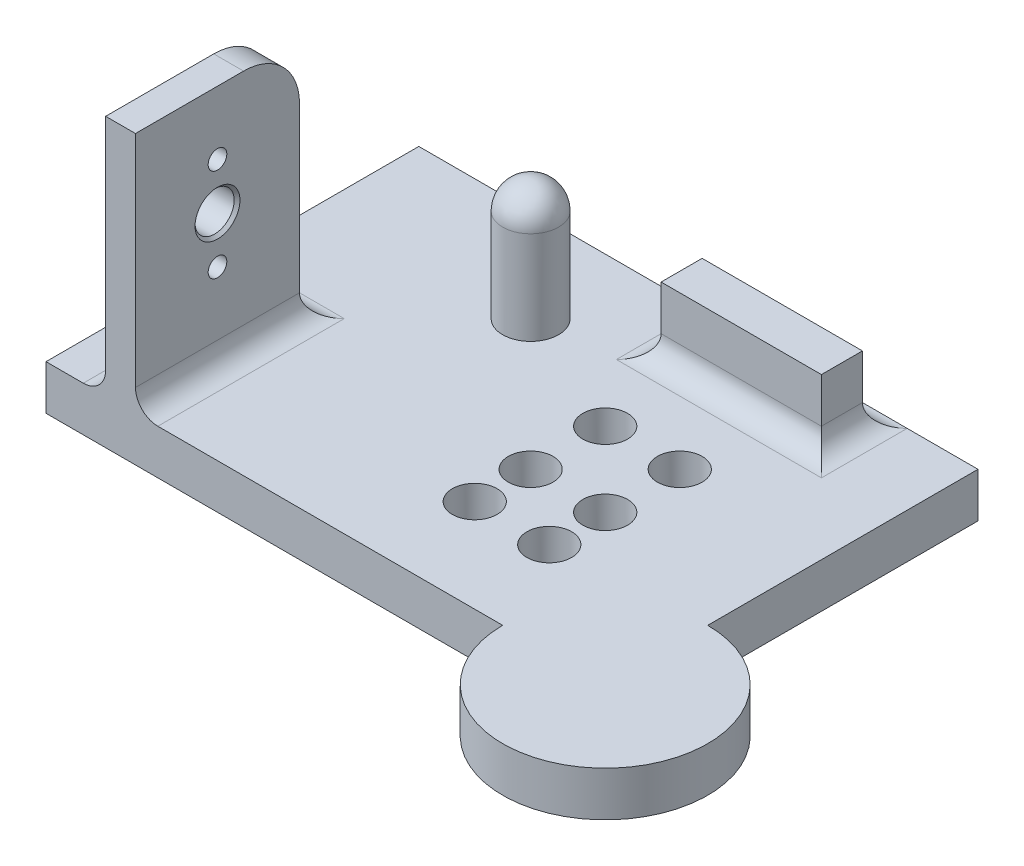
ISO-10303-21;
HEADER;
FILE_DESCRIPTION(('STEP AP214'),'2;1');
FILE_NAME('part.step','',(''),(''),'','','');
FILE_SCHEMA(('AUTOMOTIVE_DESIGN { 1 0 10303 214 1 1 1 1 }'));
ENDSEC;
DATA;
#1=APPLICATION_CONTEXT('core data for automotive mechanical design processes');
#2=APPLICATION_PROTOCOL_DEFINITION('international standard','automotive_design',2000,#1);
#3=PRODUCT_CONTEXT('',#1,'mechanical');
#4=PRODUCT('Part','Part','',(#3));
#5=PRODUCT_RELATED_PRODUCT_CATEGORY('part','',(#4));
#6=PRODUCT_DEFINITION_FORMATION('','',#4);
#7=PRODUCT_DEFINITION_CONTEXT('part definition',#1,'design');
#8=PRODUCT_DEFINITION('design','',#6,#7);
#9=PRODUCT_DEFINITION_SHAPE('','',#8);
#10=(LENGTH_UNIT() NAMED_UNIT(*) SI_UNIT(.MILLI.,.METRE.));
#11=(NAMED_UNIT(*) PLANE_ANGLE_UNIT() SI_UNIT($,.RADIAN.));
#12=(NAMED_UNIT(*) SI_UNIT($,.STERADIAN.) SOLID_ANGLE_UNIT());
#13=UNCERTAINTY_MEASURE_WITH_UNIT(LENGTH_MEASURE(1.E-05),#10,'distance_accuracy_value','');
#14=(GEOMETRIC_REPRESENTATION_CONTEXT(3) GLOBAL_UNCERTAINTY_ASSIGNED_CONTEXT((#13)) GLOBAL_UNIT_ASSIGNED_CONTEXT((#10,
#11,#12)) REPRESENTATION_CONTEXT('',''));
#15=CARTESIAN_POINT('',(0.,0.,0.));
#16=DIRECTION('',(0.,0.,1.));
#17=DIRECTION('',(1.,0.,0.));
#18=AXIS2_PLACEMENT_3D('',#15,#16,#17);
#19=CARTESIAN_POINT('',(0.,12.,0.));
#20=DIRECTION('',(0.,-1.,0.));
#21=DIRECTION('',(0.,0.,-1.));
#22=AXIS2_PLACEMENT_3D('',#19,#20,#21);
#23=PLANE('',#22);
#24=DIRECTION('',(1.,0.,0.));
#25=VECTOR('',#24,1.);
#26=CARTESIAN_POINT('',(82.,12.,-77.));
#27=LINE('',#26,#25);
#28=CARTESIAN_POINT('',(131.,12.,-77.));
#29=VERTEX_POINT('',#28);
#30=CARTESIAN_POINT('',(76.,12.,-77.));
#31=VERTEX_POINT('',#30);
#32=EDGE_CURVE('E356',#29,#31,#27,.F.);
#33=ORIENTED_EDGE('',*,*,#32,.T.);
#34=DIRECTION('',(0.,0.,1.));
#35=VECTOR('',#34,1.);
#36=CARTESIAN_POINT('',(76.,12.,-94.));
#37=LINE('',#36,#35);
#38=CARTESIAN_POINT('',(76.,12.,-100.));
#39=VERTEX_POINT('',#38);
#40=EDGE_CURVE('E360',#31,#39,#37,.F.);
#41=ORIENTED_EDGE('',*,*,#40,.T.);
#42=DIRECTION('',(-1.,0.,0.));
#43=VECTOR('',#42,1.);
#44=CARTESIAN_POINT('',(0.,12.,-100.));
#45=LINE('',#44,#43);
#46=CARTESIAN_POINT('',(0.,12.,-100.));
#47=VERTEX_POINT('',#46);
#48=EDGE_CURVE('E303',#39,#47,#45,.T.);
#49=ORIENTED_EDGE('',*,*,#48,.T.);
#50=DIRECTION('',(0.,0.,1.));
#51=VECTOR('',#50,1.);
#52=CARTESIAN_POINT('',(0.,12.,0.));
#53=LINE('',#52,#51);
#54=CARTESIAN_POINT('',(0.,12.,0.));
#55=VERTEX_POINT('',#54);
#56=EDGE_CURVE('E293',#47,#55,#53,.T.);
#57=ORIENTED_EDGE('',*,*,#56,.T.);
#58=DIRECTION('',(1.,0.,0.));
#59=VECTOR('',#58,1.);
#60=CARTESIAN_POINT('',(0.,12.,0.));
#61=LINE('',#60,#59);
#62=CARTESIAN_POINT('',(10.,12.,0.));
#63=VERTEX_POINT('',#62);
#64=EDGE_CURVE('E298',#55,#63,#61,.T.);
#65=ORIENTED_EDGE('',*,*,#64,.T.);
#66=DIRECTION('',(0.,0.,1.));
#67=VECTOR('',#66,1.);
#68=CARTESIAN_POINT('',(10.,12.,-44.));
#69=LINE('',#68,#67);
#70=CARTESIAN_POINT('',(10.,12.,-50.));
#71=VERTEX_POINT('',#70);
#72=EDGE_CURVE('E331',#63,#71,#69,.F.);
#73=ORIENTED_EDGE('',*,*,#72,.T.);
#74=DIRECTION('',(-1.,0.,0.));
#75=VECTOR('',#74,1.);
#76=CARTESIAN_POINT('',(24.,12.,-50.));
#77=LINE('',#76,#75);
#78=CARTESIAN_POINT('',(30.,12.,-50.));
#79=VERTEX_POINT('',#78);
#80=EDGE_CURVE('E329',#71,#79,#77,.F.);
#81=ORIENTED_EDGE('',*,*,#80,.T.);
#82=DIRECTION('',(0.,0.,-1.));
#83=VECTOR('',#82,1.);
#84=CARTESIAN_POINT('',(30.,12.,0.));
#85=LINE('',#84,#83);
#86=CARTESIAN_POINT('',(30.,12.,0.));
#87=VERTEX_POINT('',#86);
#88=EDGE_CURVE('E327',#79,#87,#85,.F.);
#89=ORIENTED_EDGE('',*,*,#88,.T.);
#90=CARTESIAN_POINT('',(122.5,12.,0.));
#91=VERTEX_POINT('',#90);
#92=EDGE_CURVE('E296',#87,#91,#61,.T.);
#93=ORIENTED_EDGE('',*,*,#92,.T.);
#94=CARTESIAN_POINT('',(150.,12.,0.));
#95=DIRECTION('',(0.,1.,0.));
#96=DIRECTION('',(0.,0.,1.));
#97=AXIS2_PLACEMENT_3D('',#94,#95,#96);
#98=CIRCLE('',#97,27.5);
#99=CARTESIAN_POINT('',(150.,12.,-27.5));
#100=VERTEX_POINT('',#99);
#101=EDGE_CURVE('E232',#91,#100,#98,.T.);
#102=ORIENTED_EDGE('',*,*,#101,.T.);
#103=DIRECTION('',(0.,0.,-1.));
#104=VECTOR('',#103,1.);
#105=CARTESIAN_POINT('',(150.,12.,0.));
#106=LINE('',#105,#104);
#107=CARTESIAN_POINT('',(150.,12.,-100.));
#108=VERTEX_POINT('',#107);
#109=EDGE_CURVE('E301',#100,#108,#106,.T.);
#110=ORIENTED_EDGE('',*,*,#109,.T.);
#111=CARTESIAN_POINT('',(131.,12.,-100.));
#112=VERTEX_POINT('',#111);
#113=EDGE_CURVE('E304',#108,#112,#45,.T.);
#114=ORIENTED_EDGE('',*,*,#113,.T.);
#115=DIRECTION('',(0.,0.,-1.));
#116=VECTOR('',#115,1.);
#117=CARTESIAN_POINT('',(131.,12.,-83.));
#118=LINE('',#117,#116);
#119=EDGE_CURVE('E358',#112,#29,#118,.F.);
#120=ORIENTED_EDGE('',*,*,#119,.T.);
#121=EDGE_LOOP('',(#33,#41,#49,#57,#65,#73,#81,#89,#93,#102,#110,#114,#120));
#122=FACE_BOUND('',#121,.T.);
#123=CARTESIAN_POINT('',(55.,12.,-75.));
#124=DIRECTION('',(0.,-1.,0.));
#125=DIRECTION('',(0.,0.,-1.));
#126=AXIS2_PLACEMENT_3D('',#123,#124,#125);
#127=CIRCLE('',#126,7.5);
#128=CARTESIAN_POINT('',(55.,12.,-82.5));
#129=VERTEX_POINT('',#128);
#130=EDGE_CURVE('E350',#129,#129,#127,.F.);
#131=ORIENTED_EDGE('',*,*,#130,.F.);
#132=EDGE_LOOP('',(#131));
#133=FACE_BOUND('',#132,.T.);
#134=CARTESIAN_POINT('',(90.,12.,-60.));
#135=DIRECTION('',(0.,-1.,0.));
#136=DIRECTION('',(0.,0.,-1.));
#137=AXIS2_PLACEMENT_3D('',#134,#135,#136);
#138=CIRCLE('',#137,6.);
#139=CARTESIAN_POINT('',(90.,12.,-66.));
#140=VERTEX_POINT('',#139);
#141=EDGE_CURVE('E214',#140,#140,#138,.T.);
#142=ORIENTED_EDGE('',*,*,#141,.T.);
#143=EDGE_LOOP('',(#142));
#144=FACE_BOUND('',#143,.T.);
#145=CARTESIAN_POINT('',(110.,12.,-25.));
#146=DIRECTION('',(0.,-1.,0.));
#147=DIRECTION('',(0.,0.,-1.));
#148=AXIS2_PLACEMENT_3D('',#145,#146,#147);
#149=CIRCLE('',#148,6.);
#150=CARTESIAN_POINT('',(110.,12.,-31.));
#151=VERTEX_POINT('',#150);
#152=EDGE_CURVE('E217',#151,#151,#149,.T.);
#153=ORIENTED_EDGE('',*,*,#152,.T.);
#154=EDGE_LOOP('',(#153));
#155=FACE_BOUND('',#154,.T.);
#156=CARTESIAN_POINT('',(110.,12.,-60.));
#157=DIRECTION('',(0.,-1.,0.));
#158=DIRECTION('',(0.,0.,-1.));
#159=AXIS2_PLACEMENT_3D('',#156,#157,#158);
#160=CIRCLE('',#159,6.);
#161=CARTESIAN_POINT('',(110.,12.,-66.));
#162=VERTEX_POINT('',#161);
#163=EDGE_CURVE('E220',#162,#162,#160,.T.);
#164=ORIENTED_EDGE('',*,*,#163,.T.);
#165=EDGE_LOOP('',(#164));
#166=FACE_BOUND('',#165,.T.);
#167=CARTESIAN_POINT('',(90.,12.,-40.));
#168=DIRECTION('',(0.,-1.,0.));
#169=DIRECTION('',(0.,0.,-1.));
#170=AXIS2_PLACEMENT_3D('',#167,#168,#169);
#171=CIRCLE('',#170,6.);
#172=CARTESIAN_POINT('',(90.,12.,-46.));
#173=VERTEX_POINT('',#172);
#174=EDGE_CURVE('E223',#173,#173,#171,.T.);
#175=ORIENTED_EDGE('',*,*,#174,.T.);
#176=EDGE_LOOP('',(#175));
#177=FACE_BOUND('',#176,.T.);
#178=CARTESIAN_POINT('',(110.,12.,-40.));
#179=DIRECTION('',(0.,-1.,0.));
#180=DIRECTION('',(0.,0.,-1.));
#181=AXIS2_PLACEMENT_3D('',#178,#179,#180);
#182=CIRCLE('',#181,6.);
#183=CARTESIAN_POINT('',(110.,12.,-46.));
#184=VERTEX_POINT('',#183);
#185=EDGE_CURVE('E226',#184,#184,#182,.T.);
#186=ORIENTED_EDGE('',*,*,#185,.T.);
#187=EDGE_LOOP('',(#186));
#188=FACE_BOUND('',#187,.T.);
#189=CARTESIAN_POINT('',(90.,12.,-25.));
#190=DIRECTION('',(0.,-1.,0.));
#191=DIRECTION('',(0.,0.,-1.));
#192=AXIS2_PLACEMENT_3D('',#189,#190,#191);
#193=CIRCLE('',#192,6.);
#194=CARTESIAN_POINT('',(90.,12.,-31.));
#195=VERTEX_POINT('',#194);
#196=EDGE_CURVE('E229',#195,#195,#193,.T.);
#197=ORIENTED_EDGE('',*,*,#196,.T.);
#198=EDGE_LOOP('',(#197));
#199=FACE_BOUND('',#198,.T.);
#200=ADVANCED_FACE('F44',(#122,#133,#144,#155,#166,#177,#188,#199),#23,.F.);
#201=CARTESIAN_POINT('',(16.,77.,0.));
#202=DIRECTION('',(1.,0.,0.));
#203=DIRECTION('',(0.,0.,-1.));
#204=AXIS2_PLACEMENT_3D('',#201,#202,#203);
#205=PLANE('',#204);
#206=CARTESIAN_POINT('',(16.,47.5,-22.));
#207=DIRECTION('',(1.,0.,0.));
#208=DIRECTION('',(0.,0.,-1.));
#209=AXIS2_PLACEMENT_3D('',#206,#207,#208);
#210=CIRCLE('',#209,5.24999999999999);
#211=CARTESIAN_POINT('',(16.,47.5,-27.25));
#212=VERTEX_POINT('',#211);
#213=EDGE_CURVE('E252',#212,#212,#210,.T.);
#214=ORIENTED_EDGE('',*,*,#213,.T.);
#215=EDGE_LOOP('',(#214));
#216=FACE_BOUND('',#215,.T.);
#217=CARTESIAN_POINT('',(16.,60.,-22.));
#218=DIRECTION('',(1.,0.,0.));
#219=DIRECTION('',(0.,0.,-1.));
#220=AXIS2_PLACEMENT_3D('',#217,#218,#219);
#221=CIRCLE('',#220,2.5);
#222=CARTESIAN_POINT('',(16.,60.,-24.5));
#223=VERTEX_POINT('',#222);
#224=EDGE_CURVE('E256',#223,#223,#221,.T.);
#225=ORIENTED_EDGE('',*,*,#224,.T.);
#226=EDGE_LOOP('',(#225));
#227=FACE_BOUND('',#226,.T.);
#228=CARTESIAN_POINT('',(16.,35.,-22.));
#229=DIRECTION('',(1.,0.,0.));
#230=DIRECTION('',(0.,0.,-1.));
#231=AXIS2_PLACEMENT_3D('',#228,#229,#230);
#232=CIRCLE('',#231,2.5);
#233=CARTESIAN_POINT('',(16.,35.,-24.5));
#234=VERTEX_POINT('',#233);
#235=EDGE_CURVE('E262',#234,#234,#232,.T.);
#236=ORIENTED_EDGE('',*,*,#235,.T.);
#237=EDGE_LOOP('',(#236));
#238=FACE_BOUND('',#237,.T.);
#239=DIRECTION('',(0.,0.,1.));
#240=VECTOR('',#239,1.);
#241=CARTESIAN_POINT('',(16.,77.,0.));
#242=LINE('',#241,#240);
#243=CARTESIAN_POINT('',(16.,77.,-29.));
#244=VERTEX_POINT('',#243);
#245=CARTESIAN_POINT('',(16.,77.,0.));
#246=VERTEX_POINT('',#245);
#247=EDGE_CURVE('E274',#244,#246,#242,.T.);
#248=ORIENTED_EDGE('',*,*,#247,.F.);
#249=CARTESIAN_POINT('',(16.,62.,-29.));
#250=DIRECTION('',(1.,0.,0.));
#251=DIRECTION('',(0.,0.,-1.));
#252=AXIS2_PLACEMENT_3D('',#249,#250,#251);
#253=CIRCLE('',#252,15.);
#254=CARTESIAN_POINT('',(16.,61.9999999999999,-44.));
#255=VERTEX_POINT('',#254);
#256=EDGE_CURVE('E270',#244,#255,#253,.F.);
#257=ORIENTED_EDGE('',*,*,#256,.T.);
#258=DIRECTION('',(0.,-1.,0.));
#259=VECTOR('',#258,1.);
#260=CARTESIAN_POINT('',(16.,77.,-44.));
#261=LINE('',#260,#259);
#262=CARTESIAN_POINT('',(16.,18.,-44.));
#263=VERTEX_POINT('',#262);
#264=EDGE_CURVE('E282',#255,#263,#261,.T.);
#265=ORIENTED_EDGE('',*,*,#264,.T.);
#266=DIRECTION('',(0.,0.,1.));
#267=VECTOR('',#266,1.);
#268=CARTESIAN_POINT('',(16.,18.,0.));
#269=LINE('',#268,#267);
#270=CARTESIAN_POINT('',(16.,18.,0.));
#271=VERTEX_POINT('',#270);
#272=EDGE_CURVE('E324',#263,#271,#269,.T.);
#273=ORIENTED_EDGE('',*,*,#272,.T.);
#274=DIRECTION('',(0.,-1.,0.));
#275=VECTOR('',#274,1.);
#276=CARTESIAN_POINT('',(16.,77.,0.));
#277=LINE('',#276,#275);
#278=EDGE_CURVE('E289',#246,#271,#277,.T.);
#279=ORIENTED_EDGE('',*,*,#278,.F.);
#280=EDGE_LOOP('',(#248,#257,#265,#273,#279));
#281=FACE_BOUND('',#280,.T.);
#282=ADVANCED_FACE('F430',(#216,#227,#238,#281),#205,.F.);
#283=CARTESIAN_POINT('',(24.,77.,0.));
#284=DIRECTION('',(-1.,0.,0.));
#285=DIRECTION('',(0.,0.,1.));
#286=AXIS2_PLACEMENT_3D('',#283,#284,#285);
#287=PLANE('',#286);
#288=CARTESIAN_POINT('',(24.,47.5,-22.));
#289=DIRECTION('',(1.,0.,0.));
#290=DIRECTION('',(0.,0.,-1.));
#291=AXIS2_PLACEMENT_3D('',#288,#289,#290);
#292=CIRCLE('',#291,6.025);
#293=CARTESIAN_POINT('',(24.,47.5,-28.025));
#294=VERTEX_POINT('',#293);
#295=EDGE_CURVE('E246',#294,#294,#292,.T.);
#296=ORIENTED_EDGE('',*,*,#295,.F.);
#297=EDGE_LOOP('',(#296));
#298=FACE_BOUND('',#297,.T.);
#299=CARTESIAN_POINT('',(24.,60.,-22.));
#300=DIRECTION('',(1.,0.,0.));
#301=DIRECTION('',(0.,0.,-1.));
#302=AXIS2_PLACEMENT_3D('',#299,#300,#301);
#303=CIRCLE('',#302,2.5);
#304=CARTESIAN_POINT('',(24.,60.,-24.5));
#305=VERTEX_POINT('',#304);
#306=EDGE_CURVE('E253',#305,#305,#303,.T.);
#307=ORIENTED_EDGE('',*,*,#306,.F.);
#308=EDGE_LOOP('',(#307));
#309=FACE_BOUND('',#308,.T.);
#310=CARTESIAN_POINT('',(24.,35.,-22.));
#311=DIRECTION('',(1.,0.,0.));
#312=DIRECTION('',(0.,0.,-1.));
#313=AXIS2_PLACEMENT_3D('',#310,#311,#312);
#314=CIRCLE('',#313,2.5);
#315=CARTESIAN_POINT('',(24.,35.,-24.5));
#316=VERTEX_POINT('',#315);
#317=EDGE_CURVE('E259',#316,#316,#314,.T.);
#318=ORIENTED_EDGE('',*,*,#317,.F.);
#319=EDGE_LOOP('',(#318));
#320=FACE_BOUND('',#319,.T.);
#321=DIRECTION('',(0.,-1.,0.));
#322=VECTOR('',#321,1.);
#323=CARTESIAN_POINT('',(24.,77.,-44.));
#324=LINE('',#323,#322);
#325=CARTESIAN_POINT('',(24.,61.9999999999999,-44.));
#326=VERTEX_POINT('',#325);
#327=CARTESIAN_POINT('',(24.,18.,-44.));
#328=VERTEX_POINT('',#327);
#329=EDGE_CURVE('E284',#326,#328,#324,.T.);
#330=ORIENTED_EDGE('',*,*,#329,.F.);
#331=CARTESIAN_POINT('',(24.,62.,-29.));
#332=DIRECTION('',(1.,0.,0.));
#333=DIRECTION('',(0.,0.,-1.));
#334=AXIS2_PLACEMENT_3D('',#331,#332,#333);
#335=CIRCLE('',#334,15.);
#336=CARTESIAN_POINT('',(24.,77.,-28.9999999999999));
#337=VERTEX_POINT('',#336);
#338=EDGE_CURVE('E265',#337,#326,#335,.F.);
#339=ORIENTED_EDGE('',*,*,#338,.F.);
#340=DIRECTION('',(0.,0.,-1.));
#341=VECTOR('',#340,1.);
#342=CARTESIAN_POINT('',(24.,77.,0.));
#343=LINE('',#342,#341);
#344=CARTESIAN_POINT('',(24.,77.,0.));
#345=VERTEX_POINT('',#344);
#346=EDGE_CURVE('E279',#345,#337,#343,.T.);
#347=ORIENTED_EDGE('',*,*,#346,.F.);
#348=DIRECTION('',(0.,-1.,0.));
#349=VECTOR('',#348,1.);
#350=CARTESIAN_POINT('',(24.,77.,0.));
#351=LINE('',#350,#349);
#352=CARTESIAN_POINT('',(24.,18.,0.));
#353=VERTEX_POINT('',#352);
#354=EDGE_CURVE('E286',#345,#353,#351,.T.);
#355=ORIENTED_EDGE('',*,*,#354,.T.);
#356=DIRECTION('',(0.,0.,-1.));
#357=VECTOR('',#356,1.);
#358=CARTESIAN_POINT('',(24.,18.,-44.));
#359=LINE('',#358,#357);
#360=EDGE_CURVE('E336',#353,#328,#359,.T.);
#361=ORIENTED_EDGE('',*,*,#360,.T.);
#362=EDGE_LOOP('',(#330,#339,#347,#355,#361));
#363=FACE_BOUND('',#362,.T.);
#364=ADVANCED_FACE('F423',(#298,#309,#320,#363),#287,.F.);
#365=CARTESIAN_POINT('',(16.,77.,-44.));
#366=DIRECTION('',(0.,0.,1.));
#367=DIRECTION('',(1.,0.,0.));
#368=AXIS2_PLACEMENT_3D('',#365,#366,#367);
#369=PLANE('',#368);
#370=DIRECTION('',(1.,0.,0.));
#371=VECTOR('',#370,1.);
#372=CARTESIAN_POINT('',(0.,61.9999999999999,-44.));
#373=LINE('',#372,#371);
#374=EDGE_CURVE('E267',#255,#326,#373,.T.);
#375=ORIENTED_EDGE('',*,*,#374,.T.);
#376=ORIENTED_EDGE('',*,*,#329,.T.);
#377=DIRECTION('',(-1.,0.,0.));
#378=VECTOR('',#377,1.);
#379=CARTESIAN_POINT('',(16.,18.,-44.));
#380=LINE('',#379,#378);
#381=EDGE_CURVE('E333',#328,#263,#380,.T.);
#382=ORIENTED_EDGE('',*,*,#381,.T.);
#383=ORIENTED_EDGE('',*,*,#264,.F.);
#384=EDGE_LOOP('',(#375,#376,#382,#383));
#385=FACE_BOUND('',#384,.T.);
#386=ADVANCED_FACE('F433',(#385),#369,.F.);
#387=CARTESIAN_POINT('',(0.,12.,0.));
#388=DIRECTION('',(1.,0.,0.));
#389=DIRECTION('',(0.,0.,-1.));
#390=AXIS2_PLACEMENT_3D('',#387,#388,#389);
#391=PLANE('',#390);
#392=DIRECTION('',(0.,0.,1.));
#393=VECTOR('',#392,1.);
#394=CARTESIAN_POINT('',(0.,0.,0.));
#395=LINE('',#394,#393);
#396=CARTESIAN_POINT('',(0.,0.,-100.));
#397=VERTEX_POINT('',#396);
#398=CARTESIAN_POINT('',(0.,0.,0.));
#399=VERTEX_POINT('',#398);
#400=EDGE_CURVE('E292',#397,#399,#395,.T.);
#401=ORIENTED_EDGE('',*,*,#400,.T.);
#402=DIRECTION('',(0.,-1.,0.));
#403=VECTOR('',#402,1.);
#404=CARTESIAN_POINT('',(0.,12.,0.));
#405=LINE('',#404,#403);
#406=EDGE_CURVE('E321',#55,#399,#405,.T.);
#407=ORIENTED_EDGE('',*,*,#406,.F.);
#408=ORIENTED_EDGE('',*,*,#56,.F.);
#409=DIRECTION('',(0.,-1.,0.));
#410=VECTOR('',#409,1.);
#411=CARTESIAN_POINT('',(0.,12.,-100.));
#412=LINE('',#411,#410);
#413=EDGE_CURVE('E307',#47,#397,#412,.T.);
#414=ORIENTED_EDGE('',*,*,#413,.T.);
#415=EDGE_LOOP('',(#401,#407,#408,#414));
#416=FACE_BOUND('',#415,.T.);
#417=ADVANCED_FACE('F397',(#416),#391,.F.);
#418=CARTESIAN_POINT('',(0.,12.,0.));
#419=DIRECTION('',(0.,0.,-1.));
#420=DIRECTION('',(-1.,0.,0.));
#421=AXIS2_PLACEMENT_3D('',#418,#419,#420);
#422=PLANE('',#421);
#423=DIRECTION('',(1.,0.,0.));
#424=VECTOR('',#423,1.);
#425=CARTESIAN_POINT('',(0.,0.,0.));
#426=LINE('',#425,#424);
#427=CARTESIAN_POINT('',(122.5,0.,0.));
#428=VERTEX_POINT('',#427);
#429=EDGE_CURVE('E311',#399,#428,#426,.T.);
#430=ORIENTED_EDGE('',*,*,#429,.T.);
#431=DIRECTION('',(0.,1.,0.));
#432=VECTOR('',#431,1.);
#433=CARTESIAN_POINT('',(122.5,-77.7817459305202,0.));
#434=LINE('',#433,#432);
#435=EDGE_CURVE('E241',#428,#91,#434,.T.);
#436=ORIENTED_EDGE('',*,*,#435,.T.);
#437=ORIENTED_EDGE('',*,*,#92,.F.);
#438=CARTESIAN_POINT('',(30.,18.,0.));
#439=DIRECTION('',(0.,0.,-1.));
#440=DIRECTION('',(-1.,0.,0.));
#441=AXIS2_PLACEMENT_3D('',#438,#439,#440);
#442=CIRCLE('',#441,6.);
#443=EDGE_CURVE('E341',#87,#353,#442,.T.);
#444=ORIENTED_EDGE('',*,*,#443,.T.);
#445=ORIENTED_EDGE('',*,*,#354,.F.);
#446=DIRECTION('',(1.,0.,0.));
#447=VECTOR('',#446,1.);
#448=CARTESIAN_POINT('',(16.,77.,0.));
#449=LINE('',#448,#447);
#450=EDGE_CURVE('E276',#246,#345,#449,.T.);
#451=ORIENTED_EDGE('',*,*,#450,.F.);
#452=ORIENTED_EDGE('',*,*,#278,.T.);
#453=CARTESIAN_POINT('',(10.,18.,0.));
#454=DIRECTION('',(0.,0.,-1.));
#455=DIRECTION('',(-1.,0.,0.));
#456=AXIS2_PLACEMENT_3D('',#453,#454,#455);
#457=CIRCLE('',#456,6.);
#458=EDGE_CURVE('E339',#271,#63,#457,.T.);
#459=ORIENTED_EDGE('',*,*,#458,.T.);
#460=ORIENTED_EDGE('',*,*,#64,.F.);
#461=ORIENTED_EDGE('',*,*,#406,.T.);
#462=EDGE_LOOP('',(#430,#436,#437,#444,#445,#451,#452,#459,#460,#461));
#463=FACE_BOUND('',#462,.T.);
#464=ADVANCED_FACE('F399',(#463),#422,.F.);
#465=CARTESIAN_POINT('',(150.,12.,0.));
#466=DIRECTION('',(-1.,0.,0.));
#467=DIRECTION('',(0.,0.,1.));
#468=AXIS2_PLACEMENT_3D('',#465,#466,#467);
#469=PLANE('',#468);
#470=ORIENTED_EDGE('',*,*,#109,.F.);
#471=DIRECTION('',(0.,1.,0.));
#472=VECTOR('',#471,1.);
#473=CARTESIAN_POINT('',(150.,-77.7817459305202,-27.5));
#474=LINE('',#473,#472);
#475=CARTESIAN_POINT('',(150.,0.,-27.5));
#476=VERTEX_POINT('',#475);
#477=EDGE_CURVE('E238',#476,#100,#474,.T.);
#478=ORIENTED_EDGE('',*,*,#477,.F.);
#479=DIRECTION('',(0.,0.,-1.));
#480=VECTOR('',#479,1.);
#481=CARTESIAN_POINT('',(150.,0.,0.));
#482=LINE('',#481,#480);
#483=CARTESIAN_POINT('',(150.,0.,-100.));
#484=VERTEX_POINT('',#483);
#485=EDGE_CURVE('E313',#476,#484,#482,.T.);
#486=ORIENTED_EDGE('',*,*,#485,.T.);
#487=DIRECTION('',(0.,-1.,0.));
#488=VECTOR('',#487,1.);
#489=CARTESIAN_POINT('',(150.,12.,-100.));
#490=LINE('',#489,#488);
#491=EDGE_CURVE('E318',#108,#484,#490,.T.);
#492=ORIENTED_EDGE('',*,*,#491,.F.);
#493=EDGE_LOOP('',(#470,#478,#486,#492));
#494=FACE_BOUND('',#493,.T.);
#495=ADVANCED_FACE('F463',(#494),#469,.F.);
#496=CARTESIAN_POINT('',(0.,12.,-100.));
#497=DIRECTION('',(0.,0.,1.));
#498=DIRECTION('',(1.,0.,0.));
#499=AXIS2_PLACEMENT_3D('',#496,#497,#498);
#500=PLANE('',#499);
#501=DIRECTION('',(-1.,0.,0.));
#502=VECTOR('',#501,1.);
#503=CARTESIAN_POINT('',(0.,0.,-100.));
#504=LINE('',#503,#502);
#505=EDGE_CURVE('E297',#484,#397,#504,.T.);
#506=ORIENTED_EDGE('',*,*,#505,.T.);
#507=ORIENTED_EDGE('',*,*,#413,.F.);
#508=ORIENTED_EDGE('',*,*,#48,.F.);
#509=EDGE_CURVE('E308',#112,#39,#45,.T.);
#510=ORIENTED_EDGE('',*,*,#509,.F.);
#511=ORIENTED_EDGE('',*,*,#113,.F.);
#512=ORIENTED_EDGE('',*,*,#491,.T.);
#513=EDGE_LOOP('',(#506,#507,#508,#510,#511,#512));
#514=FACE_BOUND('',#513,.T.);
#515=ADVANCED_FACE('F389',(#514),#500,.F.);
#516=CARTESIAN_POINT('',(0.,0.,0.));
#517=DIRECTION('',(0.,-1.,0.));
#518=DIRECTION('',(0.,0.,-1.));
#519=AXIS2_PLACEMENT_3D('',#516,#517,#518);
#520=PLANE('',#519);
#521=CARTESIAN_POINT('',(90.,0.,-25.));
#522=DIRECTION('',(0.,1.,0.));
#523=DIRECTION('',(0.,0.,1.));
#524=AXIS2_PLACEMENT_3D('',#521,#522,#523);
#525=CIRCLE('',#524,6.);
#526=CARTESIAN_POINT('',(90.,0.,-19.));
#527=VERTEX_POINT('',#526);
#528=EDGE_CURVE('E194',#527,#527,#525,.T.);
#529=ORIENTED_EDGE('',*,*,#528,.T.);
#530=EDGE_LOOP('',(#529));
#531=FACE_BOUND('',#530,.T.);
#532=CARTESIAN_POINT('',(110.,0.,-40.));
#533=DIRECTION('',(0.,1.,0.));
#534=DIRECTION('',(0.,0.,1.));
#535=AXIS2_PLACEMENT_3D('',#532,#533,#534);
#536=CIRCLE('',#535,6.);
#537=CARTESIAN_POINT('',(110.,0.,-34.));
#538=VERTEX_POINT('',#537);
#539=EDGE_CURVE('E200',#538,#538,#536,.T.);
#540=ORIENTED_EDGE('',*,*,#539,.T.);
#541=EDGE_LOOP('',(#540));
#542=FACE_BOUND('',#541,.T.);
#543=CARTESIAN_POINT('',(90.,0.,-40.));
#544=DIRECTION('',(0.,1.,0.));
#545=DIRECTION('',(0.,0.,1.));
#546=AXIS2_PLACEMENT_3D('',#543,#544,#545);
#547=CIRCLE('',#546,6.);
#548=CARTESIAN_POINT('',(90.,0.,-34.));
#549=VERTEX_POINT('',#548);
#550=EDGE_CURVE('E203',#549,#549,#547,.T.);
#551=ORIENTED_EDGE('',*,*,#550,.T.);
#552=EDGE_LOOP('',(#551));
#553=FACE_BOUND('',#552,.T.);
#554=CARTESIAN_POINT('',(110.,0.,-60.));
#555=DIRECTION('',(0.,1.,0.));
#556=DIRECTION('',(0.,0.,1.));
#557=AXIS2_PLACEMENT_3D('',#554,#555,#556);
#558=CIRCLE('',#557,6.);
#559=CARTESIAN_POINT('',(110.,0.,-54.));
#560=VERTEX_POINT('',#559);
#561=EDGE_CURVE('E206',#560,#560,#558,.T.);
#562=ORIENTED_EDGE('',*,*,#561,.T.);
#563=EDGE_LOOP('',(#562));
#564=FACE_BOUND('',#563,.T.);
#565=CARTESIAN_POINT('',(110.,0.,-25.));
#566=DIRECTION('',(0.,1.,0.));
#567=DIRECTION('',(0.,0.,1.));
#568=AXIS2_PLACEMENT_3D('',#565,#566,#567);
#569=CIRCLE('',#568,6.);
#570=CARTESIAN_POINT('',(110.,0.,-19.));
#571=VERTEX_POINT('',#570);
#572=EDGE_CURVE('E191',#571,#571,#569,.T.);
#573=ORIENTED_EDGE('',*,*,#572,.T.);
#574=EDGE_LOOP('',(#573));
#575=FACE_BOUND('',#574,.T.);
#576=CARTESIAN_POINT('',(90.,0.,-60.));
#577=DIRECTION('',(0.,1.,0.));
#578=DIRECTION('',(0.,0.,1.));
#579=AXIS2_PLACEMENT_3D('',#576,#577,#578);
#580=CIRCLE('',#579,6.);
#581=CARTESIAN_POINT('',(90.,0.,-54.));
#582=VERTEX_POINT('',#581);
#583=EDGE_CURVE('E209',#582,#582,#580,.T.);
#584=ORIENTED_EDGE('',*,*,#583,.T.);
#585=EDGE_LOOP('',(#584));
#586=FACE_BOUND('',#585,.T.);
#587=ORIENTED_EDGE('',*,*,#485,.F.);
#588=CARTESIAN_POINT('',(150.,0.,0.));
#589=DIRECTION('',(0.,-1.,0.));
#590=DIRECTION('',(0.,0.,-1.));
#591=AXIS2_PLACEMENT_3D('',#588,#589,#590);
#592=CIRCLE('',#591,27.5);
#593=EDGE_CURVE('E235',#428,#476,#592,.F.);
#594=ORIENTED_EDGE('',*,*,#593,.F.);
#595=ORIENTED_EDGE('',*,*,#429,.F.);
#596=ORIENTED_EDGE('',*,*,#400,.F.);
#597=ORIENTED_EDGE('',*,*,#505,.F.);
#598=EDGE_LOOP('',(#587,#594,#595,#596,#597));
#599=FACE_BOUND('',#598,.T.);
#600=ADVANCED_FACE('F457',(#531,#542,#553,#564,#575,#586,#599),#520,.T.);
#601=CARTESIAN_POINT('',(0.,77.,0.));
#602=DIRECTION('',(0.,-1.,0.));
#603=DIRECTION('',(0.,0.,-1.));
#604=AXIS2_PLACEMENT_3D('',#601,#602,#603);
#605=PLANE('',#604);
#606=ORIENTED_EDGE('',*,*,#346,.T.);
#607=DIRECTION('',(1.,0.,0.));
#608=VECTOR('',#607,1.);
#609=CARTESIAN_POINT('',(0.,77.,-29.));
#610=LINE('',#609,#608);
#611=EDGE_CURVE('E343',#337,#244,#610,.F.);
#612=ORIENTED_EDGE('',*,*,#611,.T.);
#613=ORIENTED_EDGE('',*,*,#247,.T.);
#614=ORIENTED_EDGE('',*,*,#450,.T.);
#615=EDGE_LOOP('',(#606,#612,#613,#614));
#616=FACE_BOUND('',#615,.T.);
#617=ADVANCED_FACE('F426',(#616),#605,.F.);
#618=CARTESIAN_POINT('',(30.,18.,0.));
#619=DIRECTION('',(0.,0.,1.));
#620=DIRECTION('',(1.,0.,0.));
#621=AXIS2_PLACEMENT_3D('',#618,#619,#620);
#622=CYLINDRICAL_SURFACE('',#621,6.);
#623=ORIENTED_EDGE('',*,*,#443,.F.);
#624=ORIENTED_EDGE('',*,*,#88,.F.);
#625=CARTESIAN_POINT('',(30.,18.,-50.));
#626=DIRECTION('',(0.707106781186548,0.,0.707106781186547));
#627=DIRECTION('',(-0.707106781186547,0.,0.707106781186548));
#628=AXIS2_PLACEMENT_3D('',#625,#626,#627);
#629=ELLIPSE('',#628,8.48528137423857,6.);
#630=EDGE_CURVE('E277',#328,#79,#629,.T.);
#631=ORIENTED_EDGE('',*,*,#630,.F.);
#632=ORIENTED_EDGE('',*,*,#360,.F.);
#633=EDGE_LOOP('',(#623,#624,#631,#632));
#634=FACE_BOUND('',#633,.T.);
#635=ADVANCED_FACE('F416',(#634),#622,.F.);
#636=CARTESIAN_POINT('',(16.,18.,-50.));
#637=DIRECTION('',(1.,0.,0.));
#638=DIRECTION('',(0.,0.,-1.));
#639=AXIS2_PLACEMENT_3D('',#636,#637,#638);
#640=CYLINDRICAL_SURFACE('',#639,6.);
#641=ORIENTED_EDGE('',*,*,#630,.T.);
#642=ORIENTED_EDGE('',*,*,#80,.F.);
#643=CARTESIAN_POINT('',(10.,18.,-50.));
#644=DIRECTION('',(0.707106781186547,0.,-0.707106781186548));
#645=DIRECTION('',(0.707106781186548,0.,0.707106781186547));
#646=AXIS2_PLACEMENT_3D('',#643,#644,#645);
#647=ELLIPSE('',#646,8.48528137423857,6.);
#648=EDGE_CURVE('E273',#263,#71,#647,.T.);
#649=ORIENTED_EDGE('',*,*,#648,.F.);
#650=ORIENTED_EDGE('',*,*,#381,.F.);
#651=EDGE_LOOP('',(#641,#642,#649,#650));
#652=FACE_BOUND('',#651,.T.);
#653=ADVANCED_FACE('F409',(#652),#640,.F.);
#654=CARTESIAN_POINT('',(10.,18.,0.));
#655=DIRECTION('',(0.,0.,-1.));
#656=DIRECTION('',(-1.,0.,0.));
#657=AXIS2_PLACEMENT_3D('',#654,#655,#656);
#658=CYLINDRICAL_SURFACE('',#657,6.);
#659=ORIENTED_EDGE('',*,*,#648,.T.);
#660=ORIENTED_EDGE('',*,*,#72,.F.);
#661=ORIENTED_EDGE('',*,*,#458,.F.);
#662=ORIENTED_EDGE('',*,*,#272,.F.);
#663=EDGE_LOOP('',(#659,#660,#661,#662));
#664=FACE_BOUND('',#663,.T.);
#665=ADVANCED_FACE('F404',(#664),#658,.F.);
#666=CARTESIAN_POINT('',(0.,62.,-29.));
#667=DIRECTION('',(1.,0.,0.));
#668=DIRECTION('',(0.,0.,-1.));
#669=AXIS2_PLACEMENT_3D('',#666,#667,#668);
#670=CYLINDRICAL_SURFACE('',#669,15.);
#671=ORIENTED_EDGE('',*,*,#611,.F.);
#672=ORIENTED_EDGE('',*,*,#338,.T.);
#673=ORIENTED_EDGE('',*,*,#374,.F.);
#674=ORIENTED_EDGE('',*,*,#256,.F.);
#675=EDGE_LOOP('',(#671,#672,#673,#674));
#676=FACE_BOUND('',#675,.T.);
#677=ADVANCED_FACE('F435',(#676),#670,.T.);
#678=CARTESIAN_POINT('',(24.,35.,-22.));
#679=DIRECTION('',(1.,0.,0.));
#680=DIRECTION('',(0.,0.,-1.));
#681=AXIS2_PLACEMENT_3D('',#678,#679,#680);
#682=CYLINDRICAL_SURFACE('',#681,2.5);
#683=ORIENTED_EDGE('',*,*,#317,.T.);
#684=EDGE_LOOP('',(#683));
#685=FACE_BOUND('',#684,.T.);
#686=ORIENTED_EDGE('',*,*,#235,.F.);
#687=EDGE_LOOP('',(#686));
#688=FACE_BOUND('',#687,.T.);
#689=ADVANCED_FACE('F437',(#685,#688),#682,.F.);
#690=CARTESIAN_POINT('',(24.,60.,-22.));
#691=DIRECTION('',(1.,0.,0.));
#692=DIRECTION('',(0.,0.,-1.));
#693=AXIS2_PLACEMENT_3D('',#690,#691,#692);
#694=CYLINDRICAL_SURFACE('',#693,2.5);
#695=ORIENTED_EDGE('',*,*,#306,.T.);
#696=EDGE_LOOP('',(#695));
#697=FACE_BOUND('',#696,.T.);
#698=ORIENTED_EDGE('',*,*,#224,.F.);
#699=EDGE_LOOP('',(#698));
#700=FACE_BOUND('',#699,.T.);
#701=ADVANCED_FACE('F443',(#697,#700),#694,.F.);
#702=CARTESIAN_POINT('',(24.,47.5,-22.));
#703=DIRECTION('',(1.,0.,0.));
#704=DIRECTION('',(0.,0.,-1.));
#705=AXIS2_PLACEMENT_3D('',#702,#703,#704);
#706=CYLINDRICAL_SURFACE('',#705,5.24999999999999);
#707=CARTESIAN_POINT('',(23.225,47.5,-22.));
#708=DIRECTION('',(1.,0.,0.));
#709=DIRECTION('',(0.,0.,-1.));
#710=AXIS2_PLACEMENT_3D('',#707,#708,#709);
#711=CIRCLE('',#710,5.25);
#712=CARTESIAN_POINT('',(23.225,47.5,-27.25));
#713=VERTEX_POINT('',#712);
#714=EDGE_CURVE('E249',#713,#713,#711,.T.);
#715=ORIENTED_EDGE('',*,*,#714,.T.);
#716=EDGE_LOOP('',(#715));
#717=FACE_BOUND('',#716,.T.);
#718=ORIENTED_EDGE('',*,*,#213,.F.);
#719=EDGE_LOOP('',(#718));
#720=FACE_BOUND('',#719,.T.);
#721=ADVANCED_FACE('F542',(#717,#720),#706,.F.);
#722=CARTESIAN_POINT('',(24.,47.5,-22.));
#723=DIRECTION('',(1.,0.,0.));
#724=DIRECTION('',(0.,0.,-1.));
#725=AXIS2_PLACEMENT_3D('',#722,#723,#724);
#726=CONICAL_SURFACE('',#725,6.025,0.785398163397453);
#727=ORIENTED_EDGE('',*,*,#714,.F.);
#728=EDGE_LOOP('',(#727));
#729=FACE_BOUND('',#728,.T.);
#730=ORIENTED_EDGE('',*,*,#295,.T.);
#731=EDGE_LOOP('',(#730));
#732=FACE_BOUND('',#731,.T.);
#733=ADVANCED_FACE('F538',(#729,#732),#726,.F.);
#734=CARTESIAN_POINT('',(55.,37.,-75.));
#735=DIRECTION('',(0.,-1.,0.));
#736=DIRECTION('',(0.,0.,-1.));
#737=AXIS2_PLACEMENT_3D('',#734,#735,#736);
#738=CYLINDRICAL_SURFACE('',#737,7.5);
#739=CARTESIAN_POINT('',(55.,37.,-75.));
#740=DIRECTION('',(0.,1.,0.));
#741=DIRECTION('',(0.,0.,1.));
#742=AXIS2_PLACEMENT_3D('',#739,#740,#741);
#743=CIRCLE('',#742,7.5);
#744=CARTESIAN_POINT('',(55.,37.,-67.5));
#745=VERTEX_POINT('',#744);
#746=EDGE_CURVE('E243',#745,#745,#743,.T.);
#747=ORIENTED_EDGE('',*,*,#746,.F.);
#748=EDGE_LOOP('',(#747));
#749=FACE_BOUND('',#748,.T.);
#750=ORIENTED_EDGE('',*,*,#130,.T.);
#751=EDGE_LOOP('',(#750));
#752=FACE_BOUND('',#751,.T.);
#753=ADVANCED_FACE('F534',(#749,#752),#738,.T.);
#754=CARTESIAN_POINT('',(150.,-77.7817459305202,0.));
#755=DIRECTION('',(0.,1.,0.));
#756=DIRECTION('',(0.,0.,1.));
#757=AXIS2_PLACEMENT_3D('',#754,#755,#756);
#758=CYLINDRICAL_SURFACE('',#757,27.5);
#759=ORIENTED_EDGE('',*,*,#435,.F.);
#760=ORIENTED_EDGE('',*,*,#593,.T.);
#761=ORIENTED_EDGE('',*,*,#477,.T.);
#762=ORIENTED_EDGE('',*,*,#101,.F.);
#763=EDGE_LOOP('',(#759,#760,#761,#762));
#764=FACE_BOUND('',#763,.T.);
#765=ADVANCED_FACE('F530',(#764),#758,.T.);
#766=CARTESIAN_POINT('',(90.,0.,-60.));
#767=DIRECTION('',(0.,1.,0.));
#768=DIRECTION('',(0.,0.,1.));
#769=AXIS2_PLACEMENT_3D('',#766,#767,#768);
#770=CYLINDRICAL_SURFACE('',#769,6.);
#771=ORIENTED_EDGE('',*,*,#583,.F.);
#772=EDGE_LOOP('',(#771));
#773=FACE_BOUND('',#772,.T.);
#774=ORIENTED_EDGE('',*,*,#141,.F.);
#775=EDGE_LOOP('',(#774));
#776=FACE_BOUND('',#775,.T.);
#777=ADVANCED_FACE('F512',(#773,#776),#770,.F.);
#778=CARTESIAN_POINT('',(110.,0.,-25.));
#779=DIRECTION('',(0.,1.,0.));
#780=DIRECTION('',(0.,0.,1.));
#781=AXIS2_PLACEMENT_3D('',#778,#779,#780);
#782=CYLINDRICAL_SURFACE('',#781,6.);
#783=ORIENTED_EDGE('',*,*,#572,.F.);
#784=EDGE_LOOP('',(#783));
#785=FACE_BOUND('',#784,.T.);
#786=ORIENTED_EDGE('',*,*,#152,.F.);
#787=EDGE_LOOP('',(#786));
#788=FACE_BOUND('',#787,.T.);
#789=ADVANCED_FACE('F508',(#785,#788),#782,.F.);
#790=CARTESIAN_POINT('',(110.,0.,-60.));
#791=DIRECTION('',(0.,1.,0.));
#792=DIRECTION('',(0.,0.,1.));
#793=AXIS2_PLACEMENT_3D('',#790,#791,#792);
#794=CYLINDRICAL_SURFACE('',#793,6.);
#795=ORIENTED_EDGE('',*,*,#561,.F.);
#796=EDGE_LOOP('',(#795));
#797=FACE_BOUND('',#796,.T.);
#798=ORIENTED_EDGE('',*,*,#163,.F.);
#799=EDGE_LOOP('',(#798));
#800=FACE_BOUND('',#799,.T.);
#801=ADVANCED_FACE('F511',(#797,#800),#794,.F.);
#802=CARTESIAN_POINT('',(90.,0.,-40.));
#803=DIRECTION('',(0.,1.,0.));
#804=DIRECTION('',(0.,0.,1.));
#805=AXIS2_PLACEMENT_3D('',#802,#803,#804);
#806=CYLINDRICAL_SURFACE('',#805,6.);
#807=ORIENTED_EDGE('',*,*,#550,.F.);
#808=EDGE_LOOP('',(#807));
#809=FACE_BOUND('',#808,.T.);
#810=ORIENTED_EDGE('',*,*,#174,.F.);
#811=EDGE_LOOP('',(#810));
#812=FACE_BOUND('',#811,.T.);
#813=ADVANCED_FACE('F517',(#809,#812),#806,.F.);
#814=CARTESIAN_POINT('',(110.,0.,-40.));
#815=DIRECTION('',(0.,1.,0.));
#816=DIRECTION('',(0.,0.,1.));
#817=AXIS2_PLACEMENT_3D('',#814,#815,#816);
#818=CYLINDRICAL_SURFACE('',#817,6.);
#819=ORIENTED_EDGE('',*,*,#539,.F.);
#820=EDGE_LOOP('',(#819));
#821=FACE_BOUND('',#820,.T.);
#822=ORIENTED_EDGE('',*,*,#185,.F.);
#823=EDGE_LOOP('',(#822));
#824=FACE_BOUND('',#823,.T.);
#825=ADVANCED_FACE('F514',(#821,#824),#818,.F.);
#826=CARTESIAN_POINT('',(90.,0.,-25.));
#827=DIRECTION('',(0.,1.,0.));
#828=DIRECTION('',(0.,0.,1.));
#829=AXIS2_PLACEMENT_3D('',#826,#827,#828);
#830=CYLINDRICAL_SURFACE('',#829,6.);
#831=ORIENTED_EDGE('',*,*,#528,.F.);
#832=EDGE_LOOP('',(#831));
#833=FACE_BOUND('',#832,.T.);
#834=ORIENTED_EDGE('',*,*,#196,.F.);
#835=EDGE_LOOP('',(#834));
#836=FACE_BOUND('',#835,.T.);
#837=ADVANCED_FACE('F506',(#833,#836),#830,.F.);
#838=CARTESIAN_POINT('',(55.,37.,-75.));
#839=DIRECTION('',(0.,0.,1.));
#840=DIRECTION('',(1.,0.,0.));
#841=AXIS2_PLACEMENT_3D('',#838,#839,#840);
#842=SPHERICAL_SURFACE('',#841,7.5);
#843=CARTESIAN_POINT('',(55.,37.,-75.));
#844=DIRECTION('',(0.,1.,0.));
#845=DIRECTION('',(0.,0.,1.));
#846=AXIS2_PLACEMENT_3D('',#843,#844,#845);
#847=SPHERICAL_SURFACE('',#846,7.5);
#848=ORIENTED_EDGE('',*,*,#746,.T.);
#849=EDGE_LOOP('',(#848));
#850=FACE_BOUND('',#849,.T.);
#851=ADVANCED_FACE('F503',(#850),#847,.T.);
#852=CARTESIAN_POINT('',(82.,30.,-94.));
#853=DIRECTION('',(1.,0.,0.));
#854=DIRECTION('',(0.,0.,-1.));
#855=AXIS2_PLACEMENT_3D('',#852,#853,#854);
#856=PLANE('',#855);
#857=DIRECTION('',(0.,-1.,0.));
#858=VECTOR('',#857,1.);
#859=CARTESIAN_POINT('',(82.,30.,-94.));
#860=LINE('',#859,#858);
#861=CARTESIAN_POINT('',(82.,30.,-94.));
#862=VERTEX_POINT('',#861);
#863=CARTESIAN_POINT('',(82.,18.,-94.));
#864=VERTEX_POINT('',#863);
#865=EDGE_CURVE('E842',#862,#864,#860,.T.);
#866=ORIENTED_EDGE('',*,*,#865,.T.);
#867=DIRECTION('',(0.,0.,1.));
#868=VECTOR('',#867,1.);
#869=CARTESIAN_POINT('',(82.,18.,-83.));
#870=LINE('',#869,#868);
#871=CARTESIAN_POINT('',(82.,18.,-83.));
#872=VERTEX_POINT('',#871);
#873=EDGE_CURVE('E190',#864,#872,#870,.T.);
#874=ORIENTED_EDGE('',*,*,#873,.T.);
#875=DIRECTION('',(0.,-1.,0.));
#876=VECTOR('',#875,1.);
#877=CARTESIAN_POINT('',(82.,30.,-83.));
#878=LINE('',#877,#876);
#879=CARTESIAN_POINT('',(82.,30.,-83.));
#880=VERTEX_POINT('',#879);
#881=EDGE_CURVE('E172',#880,#872,#878,.T.);
#882=ORIENTED_EDGE('',*,*,#881,.F.);
#883=DIRECTION('',(0.,0.,1.));
#884=VECTOR('',#883,1.);
#885=CARTESIAN_POINT('',(82.,30.,-94.));
#886=LINE('',#885,#884);
#887=EDGE_CURVE('E177',#862,#880,#886,.T.);
#888=ORIENTED_EDGE('',*,*,#887,.F.);
#889=EDGE_LOOP('',(#866,#874,#882,#888));
#890=FACE_BOUND('',#889,.T.);
#891=ADVANCED_FACE('F188',(#890),#856,.F.);
#892=CARTESIAN_POINT('',(82.,30.,-83.));
#893=DIRECTION('',(0.,0.,-1.));
#894=DIRECTION('',(-1.,0.,0.));
#895=AXIS2_PLACEMENT_3D('',#892,#893,#894);
#896=PLANE('',#895);
#897=ORIENTED_EDGE('',*,*,#881,.T.);
#898=DIRECTION('',(1.,0.,0.));
#899=VECTOR('',#898,1.);
#900=CARTESIAN_POINT('',(125.,18.,-83.));
#901=LINE('',#900,#899);
#902=CARTESIAN_POINT('',(125.,18.,-83.));
#903=VERTEX_POINT('',#902);
#904=EDGE_CURVE('E11',#872,#903,#901,.T.);
#905=ORIENTED_EDGE('',*,*,#904,.T.);
#906=DIRECTION('',(0.,-1.,0.));
#907=VECTOR('',#906,1.);
#908=CARTESIAN_POINT('',(125.,30.,-83.));
#909=LINE('',#908,#907);
#910=CARTESIAN_POINT('',(125.,30.,-83.));
#911=VERTEX_POINT('',#910);
#912=EDGE_CURVE('E173',#911,#903,#909,.T.);
#913=ORIENTED_EDGE('',*,*,#912,.F.);
#914=DIRECTION('',(1.,0.,0.));
#915=VECTOR('',#914,1.);
#916=CARTESIAN_POINT('',(82.,30.,-83.));
#917=LINE('',#916,#915);
#918=EDGE_CURVE('E168',#880,#911,#917,.T.);
#919=ORIENTED_EDGE('',*,*,#918,.F.);
#920=EDGE_LOOP('',(#897,#905,#913,#919));
#921=FACE_BOUND('',#920,.T.);
#922=ADVANCED_FACE('F170',(#921),#896,.F.);
#923=CARTESIAN_POINT('',(125.,30.,-94.));
#924=DIRECTION('',(-1.,0.,0.));
#925=DIRECTION('',(0.,0.,1.));
#926=AXIS2_PLACEMENT_3D('',#923,#924,#925);
#927=PLANE('',#926);
#928=ORIENTED_EDGE('',*,*,#912,.T.);
#929=DIRECTION('',(0.,0.,-1.));
#930=VECTOR('',#929,1.);
#931=CARTESIAN_POINT('',(125.,18.,-94.));
#932=LINE('',#931,#930);
#933=CARTESIAN_POINT('',(125.,18.,-94.));
#934=VERTEX_POINT('',#933);
#935=EDGE_CURVE('E53',#903,#934,#932,.T.);
#936=ORIENTED_EDGE('',*,*,#935,.T.);
#937=DIRECTION('',(0.,-1.,0.));
#938=VECTOR('',#937,1.);
#939=CARTESIAN_POINT('',(125.,30.,-94.));
#940=LINE('',#939,#938);
#941=CARTESIAN_POINT('',(125.,30.,-94.));
#942=VERTEX_POINT('',#941);
#943=EDGE_CURVE('E196',#942,#934,#940,.T.);
#944=ORIENTED_EDGE('',*,*,#943,.F.);
#945=DIRECTION('',(0.,0.,-1.));
#946=VECTOR('',#945,1.);
#947=CARTESIAN_POINT('',(125.,30.,-94.));
#948=LINE('',#947,#946);
#949=EDGE_CURVE('E176',#911,#942,#948,.T.);
#950=ORIENTED_EDGE('',*,*,#949,.F.);
#951=EDGE_LOOP('',(#928,#936,#944,#950));
#952=FACE_BOUND('',#951,.T.);
#953=ADVANCED_FACE('F493',(#952),#927,.F.);
#954=CARTESIAN_POINT('',(82.,30.,-94.));
#955=DIRECTION('',(0.,0.,1.));
#956=DIRECTION('',(1.,0.,0.));
#957=AXIS2_PLACEMENT_3D('',#954,#955,#956);
#958=PLANE('',#957);
#959=ORIENTED_EDGE('',*,*,#943,.T.);
#960=DIRECTION('',(-1.,0.,0.));
#961=VECTOR('',#960,1.);
#962=CARTESIAN_POINT('',(82.,18.,-94.));
#963=LINE('',#962,#961);
#964=EDGE_CURVE('E363',#934,#864,#963,.T.);
#965=ORIENTED_EDGE('',*,*,#964,.T.);
#966=ORIENTED_EDGE('',*,*,#865,.F.);
#967=DIRECTION('',(-1.,0.,0.));
#968=VECTOR('',#967,1.);
#969=CARTESIAN_POINT('',(82.,30.,-94.));
#970=LINE('',#969,#968);
#971=EDGE_CURVE('E182',#942,#862,#970,.T.);
#972=ORIENTED_EDGE('',*,*,#971,.F.);
#973=EDGE_LOOP('',(#959,#965,#966,#972));
#974=FACE_BOUND('',#973,.T.);
#975=ADVANCED_FACE('F488',(#974),#958,.F.);
#976=CARTESIAN_POINT('',(0.,30.,0.));
#977=DIRECTION('',(0.,1.,0.));
#978=DIRECTION('',(0.,0.,1.));
#979=AXIS2_PLACEMENT_3D('',#976,#977,#978);
#980=PLANE('',#979);
#981=ORIENTED_EDGE('',*,*,#887,.T.);
#982=ORIENTED_EDGE('',*,*,#918,.T.);
#983=ORIENTED_EDGE('',*,*,#949,.T.);
#984=ORIENTED_EDGE('',*,*,#971,.T.);
#985=EDGE_LOOP('',(#981,#982,#983,#984));
#986=FACE_BOUND('',#985,.T.);
#987=ADVANCED_FACE('F180',(#986),#980,.T.);
#988=CARTESIAN_POINT('',(131.,18.,-94.));
#989=DIRECTION('',(0.,0.,1.));
#990=DIRECTION('',(1.,0.,0.));
#991=AXIS2_PLACEMENT_3D('',#988,#989,#990);
#992=CYLINDRICAL_SURFACE('',#991,6.);
#993=CARTESIAN_POINT('',(131.,18.,-77.));
#994=DIRECTION('',(-0.707106781186547,0.,0.707106781186547));
#995=DIRECTION('',(-0.707106781186547,0.,-0.707106781186547));
#996=AXIS2_PLACEMENT_3D('',#993,#994,#995);
#997=ELLIPSE('',#996,8.48528137423857,6.);
#998=EDGE_CURVE('E369',#29,#903,#997,.F.);
#999=ORIENTED_EDGE('',*,*,#998,.F.);
#1000=ORIENTED_EDGE('',*,*,#119,.F.);
#1001=CARTESIAN_POINT('',(131.,18.,-100.));
#1002=DIRECTION('',(0.707106781186547,0.,0.707106781186547));
#1003=DIRECTION('',(-0.707106781186547,0.,0.707106781186547));
#1004=AXIS2_PLACEMENT_3D('',#1001,#1002,#1003);
#1005=ELLIPSE('',#1004,8.48528137423857,6.);
#1006=EDGE_CURVE('E48',#934,#112,#1005,.T.);
#1007=ORIENTED_EDGE('',*,*,#1006,.F.);
#1008=ORIENTED_EDGE('',*,*,#935,.F.);
#1009=EDGE_LOOP('',(#999,#1000,#1007,#1008));
#1010=FACE_BOUND('',#1009,.T.);
#1011=ADVANCED_FACE('F46',(#1010),#992,.F.);
#1012=CARTESIAN_POINT('',(82.,18.,-100.));
#1013=DIRECTION('',(1.,0.,0.));
#1014=DIRECTION('',(0.,0.,-1.));
#1015=AXIS2_PLACEMENT_3D('',#1012,#1013,#1014);
#1016=CYLINDRICAL_SURFACE('',#1015,6.);
#1017=ORIENTED_EDGE('',*,*,#1006,.T.);
#1018=ORIENTED_EDGE('',*,*,#509,.T.);
#1019=CARTESIAN_POINT('',(76.,18.,-100.));
#1020=DIRECTION('',(0.707106781186547,0.,-0.707106781186547));
#1021=DIRECTION('',(0.707106781186547,0.,0.707106781186547));
#1022=AXIS2_PLACEMENT_3D('',#1019,#1020,#1021);
#1023=ELLIPSE('',#1022,8.48528137423857,6.);
#1024=EDGE_CURVE('E368',#864,#39,#1023,.T.);
#1025=ORIENTED_EDGE('',*,*,#1024,.F.);
#1026=ORIENTED_EDGE('',*,*,#964,.F.);
#1027=EDGE_LOOP('',(#1017,#1018,#1025,#1026));
#1028=FACE_BOUND('',#1027,.T.);
#1029=ADVANCED_FACE('F379',(#1028),#1016,.F.);
#1030=CARTESIAN_POINT('',(82.,18.,-77.));
#1031=DIRECTION('',(-1.,0.,0.));
#1032=DIRECTION('',(0.,0.,1.));
#1033=AXIS2_PLACEMENT_3D('',#1030,#1031,#1032);
#1034=CYLINDRICAL_SURFACE('',#1033,6.);
#1035=ORIENTED_EDGE('',*,*,#998,.T.);
#1036=ORIENTED_EDGE('',*,*,#904,.F.);
#1037=CARTESIAN_POINT('',(76.,18.,-77.));
#1038=DIRECTION('',(-0.707106781186547,0.,-0.707106781186547));
#1039=DIRECTION('',(-0.707106781186547,0.,0.707106781186547));
#1040=AXIS2_PLACEMENT_3D('',#1037,#1038,#1039);
#1041=ELLIPSE('',#1040,8.48528137423857,6.);
#1042=EDGE_CURVE('E366',#31,#872,#1041,.F.);
#1043=ORIENTED_EDGE('',*,*,#1042,.F.);
#1044=ORIENTED_EDGE('',*,*,#32,.F.);
#1045=EDGE_LOOP('',(#1035,#1036,#1043,#1044));
#1046=FACE_BOUND('',#1045,.T.);
#1047=ADVANCED_FACE('F478',(#1046),#1034,.F.);
#1048=CARTESIAN_POINT('',(76.,18.,-94.));
#1049=DIRECTION('',(0.,0.,-1.));
#1050=DIRECTION('',(-1.,0.,0.));
#1051=AXIS2_PLACEMENT_3D('',#1048,#1049,#1050);
#1052=CYLINDRICAL_SURFACE('',#1051,6.);
#1053=ORIENTED_EDGE('',*,*,#1024,.T.);
#1054=ORIENTED_EDGE('',*,*,#40,.F.);
#1055=ORIENTED_EDGE('',*,*,#1042,.T.);
#1056=ORIENTED_EDGE('',*,*,#873,.F.);
#1057=EDGE_LOOP('',(#1053,#1054,#1055,#1056));
#1058=FACE_BOUND('',#1057,.T.);
#1059=ADVANCED_FACE('F475',(#1058),#1052,.F.);
#1060=CLOSED_SHELL('',(#200,#282,#364,#386,#417,#464,#495,#515,#600,#617,#635,#653,#665,#677,
#689,#701,#721,#733,#753,#765,#777,#789,#801,#813,#825,#837,#851,#891,#922,#953,#975,#987,#1011,
#1029,#1047,#1059));
#1061=MANIFOLD_SOLID_BREP('B2',#1060);
#1062=ADVANCED_BREP_SHAPE_REPRESENTATION('',(#18,#1061),#14);
#1063=SHAPE_DEFINITION_REPRESENTATION(#9,#1062);
ENDSEC;
END-ISO-10303-21;
